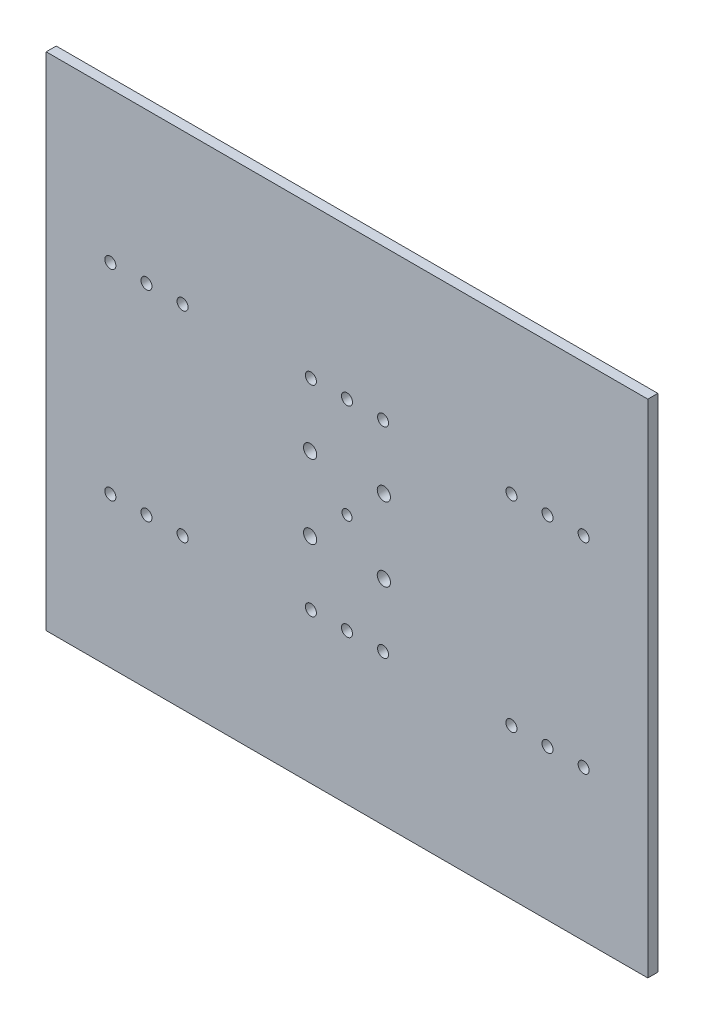
ISO-10303-21;
HEADER;
FILE_DESCRIPTION(('STEP AP214'),'2;1');
FILE_NAME('part.step','',(''),(''),'','','');
FILE_SCHEMA(('AUTOMOTIVE_DESIGN { 1 0 10303 214 1 1 1 1 }'));
ENDSEC;
DATA;
#1=APPLICATION_CONTEXT('core data for automotive mechanical design processes');
#2=APPLICATION_PROTOCOL_DEFINITION('international standard','automotive_design',2000,#1);
#3=PRODUCT_CONTEXT('',#1,'mechanical');
#4=PRODUCT('Part','Part','',(#3));
#5=PRODUCT_RELATED_PRODUCT_CATEGORY('part','',(#4));
#6=PRODUCT_DEFINITION_FORMATION('','',#4);
#7=PRODUCT_DEFINITION_CONTEXT('part definition',#1,'design');
#8=PRODUCT_DEFINITION('design','',#6,#7);
#9=PRODUCT_DEFINITION_SHAPE('','',#8);
#10=(LENGTH_UNIT() NAMED_UNIT(*) SI_UNIT(.MILLI.,.METRE.));
#11=(NAMED_UNIT(*) PLANE_ANGLE_UNIT() SI_UNIT($,.RADIAN.));
#12=(NAMED_UNIT(*) SI_UNIT($,.STERADIAN.) SOLID_ANGLE_UNIT());
#13=UNCERTAINTY_MEASURE_WITH_UNIT(LENGTH_MEASURE(1.E-05),#10,'distance_accuracy_value','');
#14=(GEOMETRIC_REPRESENTATION_CONTEXT(3) GLOBAL_UNCERTAINTY_ASSIGNED_CONTEXT((#13)) GLOBAL_UNIT_ASSIGNED_CONTEXT((#10,
#11,#12)) REPRESENTATION_CONTEXT('',''));
#15=CARTESIAN_POINT('',(0.,0.,0.));
#16=DIRECTION('',(0.,0.,1.));
#17=DIRECTION('',(1.,0.,0.));
#18=AXIS2_PLACEMENT_3D('',#15,#16,#17);
#19=CARTESIAN_POINT('',(0.,0.,5.));
#20=DIRECTION('',(0.,0.,1.));
#21=DIRECTION('',(1.,0.,0.));
#22=AXIS2_PLACEMENT_3D('',#19,#20,#21);
#23=PLANE('',#22);
#24=CARTESIAN_POINT('',(118.,-49.9999999999999,5.));
#25=DIRECTION('',(0.,0.,1.));
#26=DIRECTION('',(1.,0.,0.));
#27=AXIS2_PLACEMENT_3D('',#24,#25,#26);
#28=CIRCLE('',#27,2.75000000000001);
#29=CARTESIAN_POINT('',(120.75,-49.9999999999999,5.));
#30=VERTEX_POINT('',#29);
#31=EDGE_CURVE('E257',#30,#30,#28,.T.);
#32=ORIENTED_EDGE('',*,*,#31,.F.);
#33=EDGE_LOOP('',(#32));
#34=FACE_BOUND('',#33,.T.);
#35=CARTESIAN_POINT('',(-18.,-49.9999999999999,5.));
#36=DIRECTION('',(0.,0.,1.));
#37=DIRECTION('',(-1.,0.,0.));
#38=AXIS2_PLACEMENT_3D('',#35,#36,#37);
#39=CIRCLE('',#38,2.75);
#40=CARTESIAN_POINT('',(-20.75,-49.9999999999999,5.));
#41=VERTEX_POINT('',#40);
#42=EDGE_CURVE('E266',#41,#41,#39,.T.);
#43=ORIENTED_EDGE('',*,*,#42,.F.);
#44=EDGE_LOOP('',(#43));
#45=FACE_BOUND('',#44,.T.);
#46=CARTESIAN_POINT('',(-18.,50.,5.));
#47=DIRECTION('',(0.,0.,1.));
#48=DIRECTION('',(1.,0.,0.));
#49=AXIS2_PLACEMENT_3D('',#46,#47,#48);
#50=CIRCLE('',#49,2.75);
#51=CARTESIAN_POINT('',(-15.25,50.,5.));
#52=VERTEX_POINT('',#51);
#53=EDGE_CURVE('E241',#52,#52,#50,.T.);
#54=ORIENTED_EDGE('',*,*,#53,.F.);
#55=EDGE_LOOP('',(#54));
#56=FACE_BOUND('',#55,.T.);
#57=CARTESIAN_POINT('',(-118.,-49.9999999999999,5.));
#58=DIRECTION('',(0.,0.,1.));
#59=DIRECTION('',(-1.,0.,0.));
#60=AXIS2_PLACEMENT_3D('',#57,#58,#59);
#61=CIRCLE('',#60,2.75000000000001);
#62=CARTESIAN_POINT('',(-120.75,-49.9999999999999,5.));
#63=VERTEX_POINT('',#62);
#64=EDGE_CURVE('E250',#63,#63,#61,.T.);
#65=ORIENTED_EDGE('',*,*,#64,.F.);
#66=EDGE_LOOP('',(#65));
#67=FACE_BOUND('',#66,.T.);
#68=CARTESIAN_POINT('',(81.9999999999999,-49.9999999999999,5.));
#69=DIRECTION('',(0.,0.,1.));
#70=DIRECTION('',(-1.,0.,0.));
#71=AXIS2_PLACEMENT_3D('',#68,#69,#70);
#72=CIRCLE('',#71,2.74999999999998);
#73=CARTESIAN_POINT('',(79.2499999999999,-49.9999999999999,5.));
#74=VERTEX_POINT('',#73);
#75=EDGE_CURVE('E298',#74,#74,#72,.T.);
#76=ORIENTED_EDGE('',*,*,#75,.F.);
#77=EDGE_LOOP('',(#76));
#78=FACE_BOUND('',#77,.T.);
#79=CARTESIAN_POINT('',(17.9999999999999,-49.9999999999999,5.));
#80=DIRECTION('',(0.,0.,1.));
#81=DIRECTION('',(1.,0.,0.));
#82=AXIS2_PLACEMENT_3D('',#79,#80,#81);
#83=CIRCLE('',#82,2.75);
#84=CARTESIAN_POINT('',(20.7499999999999,-49.9999999999999,5.));
#85=VERTEX_POINT('',#84);
#86=EDGE_CURVE('E290',#85,#85,#83,.T.);
#87=ORIENTED_EDGE('',*,*,#86,.F.);
#88=EDGE_LOOP('',(#87));
#89=FACE_BOUND('',#88,.T.);
#90=CARTESIAN_POINT('',(17.9999999999999,50.,5.));
#91=DIRECTION('',(0.,0.,1.));
#92=DIRECTION('',(-1.,0.,0.));
#93=AXIS2_PLACEMENT_3D('',#90,#91,#92);
#94=CIRCLE('',#93,2.75);
#95=CARTESIAN_POINT('',(15.2499999999999,50.,5.));
#96=VERTEX_POINT('',#95);
#97=EDGE_CURVE('E282',#96,#96,#94,.T.);
#98=ORIENTED_EDGE('',*,*,#97,.F.);
#99=EDGE_LOOP('',(#98));
#100=FACE_BOUND('',#99,.T.);
#101=CARTESIAN_POINT('',(81.9999999999999,50.,5.));
#102=DIRECTION('',(0.,0.,1.));
#103=DIRECTION('',(1.,0.,0.));
#104=AXIS2_PLACEMENT_3D('',#101,#102,#103);
#105=CIRCLE('',#104,2.75000000000001);
#106=CARTESIAN_POINT('',(84.7499999999999,50.,5.));
#107=VERTEX_POINT('',#106);
#108=EDGE_CURVE('E273',#107,#107,#105,.T.);
#109=ORIENTED_EDGE('',*,*,#108,.F.);
#110=EDGE_LOOP('',(#109));
#111=FACE_BOUND('',#110,.T.);
#112=CARTESIAN_POINT('',(-82.,-49.9999999999999,5.));
#113=DIRECTION('',(0.,0.,1.));
#114=DIRECTION('',(1.,0.,0.));
#115=AXIS2_PLACEMENT_3D('',#112,#113,#114);
#116=CIRCLE('',#115,2.74999999999998);
#117=CARTESIAN_POINT('',(-79.25,-49.9999999999999,5.));
#118=VERTEX_POINT('',#117);
#119=EDGE_CURVE('E177',#118,#118,#116,.T.);
#120=ORIENTED_EDGE('',*,*,#119,.F.);
#121=EDGE_LOOP('',(#120));
#122=FACE_BOUND('',#121,.T.);
#123=CARTESIAN_POINT('',(-82.,50.,5.));
#124=DIRECTION('',(0.,0.,1.));
#125=DIRECTION('',(-1.,0.,0.));
#126=AXIS2_PLACEMENT_3D('',#123,#124,#125);
#127=CIRCLE('',#126,2.75000000000001);
#128=CARTESIAN_POINT('',(-84.75,50.,5.));
#129=VERTEX_POINT('',#128);
#130=EDGE_CURVE('E186',#129,#129,#127,.T.);
#131=ORIENTED_EDGE('',*,*,#130,.F.);
#132=EDGE_LOOP('',(#131));
#133=FACE_BOUND('',#132,.T.);
#134=CARTESIAN_POINT('',(-118.,50.,5.));
#135=DIRECTION('',(0.,0.,1.));
#136=DIRECTION('',(1.,0.,0.));
#137=AXIS2_PLACEMENT_3D('',#134,#135,#136);
#138=CIRCLE('',#137,2.75000000000001);
#139=CARTESIAN_POINT('',(-115.25,50.,5.));
#140=VERTEX_POINT('',#139);
#141=EDGE_CURVE('E194',#140,#140,#138,.T.);
#142=ORIENTED_EDGE('',*,*,#141,.F.);
#143=EDGE_LOOP('',(#142));
#144=FACE_BOUND('',#143,.T.);
#145=CARTESIAN_POINT('',(-100.,-50.,5.));
#146=DIRECTION('',(0.,0.,1.));
#147=DIRECTION('',(1.,0.,0.));
#148=AXIS2_PLACEMENT_3D('',#145,#146,#147);
#149=CIRCLE('',#148,2.75000000000001);
#150=CARTESIAN_POINT('',(-97.25,-50.,5.));
#151=VERTEX_POINT('',#150);
#152=EDGE_CURVE('E202',#151,#151,#149,.T.);
#153=ORIENTED_EDGE('',*,*,#152,.F.);
#154=EDGE_LOOP('',(#153));
#155=FACE_BOUND('',#154,.T.);
#156=CARTESIAN_POINT('',(0.,-50.,5.));
#157=DIRECTION('',(0.,0.,1.));
#158=DIRECTION('',(1.,0.,0.));
#159=AXIS2_PLACEMENT_3D('',#156,#157,#158);
#160=CIRCLE('',#159,2.75);
#161=CARTESIAN_POINT('',(2.75,-50.,5.));
#162=VERTEX_POINT('',#161);
#163=EDGE_CURVE('E210',#162,#162,#160,.T.);
#164=ORIENTED_EDGE('',*,*,#163,.F.);
#165=EDGE_LOOP('',(#164));
#166=FACE_BOUND('',#165,.T.);
#167=CARTESIAN_POINT('',(100.,-50.,5.));
#168=DIRECTION('',(0.,0.,1.));
#169=DIRECTION('',(1.,0.,0.));
#170=AXIS2_PLACEMENT_3D('',#167,#168,#169);
#171=CIRCLE('',#170,2.75000000000001);
#172=CARTESIAN_POINT('',(102.75,-50.,5.));
#173=VERTEX_POINT('',#172);
#174=EDGE_CURVE('E218',#173,#173,#171,.T.);
#175=ORIENTED_EDGE('',*,*,#174,.F.);
#176=EDGE_LOOP('',(#175));
#177=FACE_BOUND('',#176,.T.);
#178=CARTESIAN_POINT('',(100.,50.,5.));
#179=DIRECTION('',(0.,0.,1.));
#180=DIRECTION('',(1.,0.,0.));
#181=AXIS2_PLACEMENT_3D('',#178,#179,#180);
#182=CIRCLE('',#181,2.75000000000001);
#183=CARTESIAN_POINT('',(102.75,50.,5.));
#184=VERTEX_POINT('',#183);
#185=EDGE_CURVE('E226',#184,#184,#182,.T.);
#186=ORIENTED_EDGE('',*,*,#185,.F.);
#187=EDGE_LOOP('',(#186));
#188=FACE_BOUND('',#187,.T.);
#189=CARTESIAN_POINT('',(0.,50.,5.));
#190=DIRECTION('',(0.,0.,1.));
#191=DIRECTION('',(1.,0.,0.));
#192=AXIS2_PLACEMENT_3D('',#189,#190,#191);
#193=CIRCLE('',#192,2.75);
#194=CARTESIAN_POINT('',(2.75,50.,5.));
#195=VERTEX_POINT('',#194);
#196=EDGE_CURVE('E234',#195,#195,#193,.T.);
#197=ORIENTED_EDGE('',*,*,#196,.F.);
#198=EDGE_LOOP('',(#197));
#199=FACE_BOUND('',#198,.T.);
#200=CARTESIAN_POINT('',(118.,50.,5.));
#201=DIRECTION('',(0.,0.,1.));
#202=DIRECTION('',(-1.,0.,0.));
#203=AXIS2_PLACEMENT_3D('',#200,#201,#202);
#204=CIRCLE('',#203,2.75000000000001);
#205=CARTESIAN_POINT('',(115.25,50.,5.));
#206=VERTEX_POINT('',#205);
#207=EDGE_CURVE('E305',#206,#206,#204,.T.);
#208=ORIENTED_EDGE('',*,*,#207,.F.);
#209=EDGE_LOOP('',(#208));
#210=FACE_BOUND('',#209,.T.);
#211=CARTESIAN_POINT('',(-100.,50.,5.));
#212=DIRECTION('',(0.,0.,1.));
#213=DIRECTION('',(1.,0.,0.));
#214=AXIS2_PLACEMENT_3D('',#211,#212,#213);
#215=CIRCLE('',#214,2.75000000000001);
#216=CARTESIAN_POINT('',(-97.25,50.,5.));
#217=VERTEX_POINT('',#216);
#218=EDGE_CURVE('E169',#217,#217,#215,.T.);
#219=ORIENTED_EDGE('',*,*,#218,.F.);
#220=EDGE_LOOP('',(#219));
#221=FACE_BOUND('',#220,.T.);
#222=CARTESIAN_POINT('',(-18.3847763108501,-18.3847763108503,5.));
#223=DIRECTION('',(0.,0.,1.));
#224=DIRECTION('',(-1.,0.,0.));
#225=AXIS2_PLACEMENT_3D('',#222,#223,#224);
#226=CIRCLE('',#225,3.29999999999999);
#227=CARTESIAN_POINT('',(-21.6847763108501,-18.3847763108503,5.));
#228=VERTEX_POINT('',#227);
#229=EDGE_CURVE('E149',#228,#228,#226,.T.);
#230=ORIENTED_EDGE('',*,*,#229,.F.);
#231=EDGE_LOOP('',(#230));
#232=FACE_BOUND('',#231,.T.);
#233=CARTESIAN_POINT('',(18.38477631085,18.3847763108503,5.));
#234=DIRECTION('',(0.,0.,1.));
#235=DIRECTION('',(-1.,0.,0.));
#236=AXIS2_PLACEMENT_3D('',#233,#234,#235);
#237=CIRCLE('',#236,3.3);
#238=CARTESIAN_POINT('',(15.08477631085,18.3847763108503,5.));
#239=VERTEX_POINT('',#238);
#240=EDGE_CURVE('E133',#239,#239,#237,.T.);
#241=ORIENTED_EDGE('',*,*,#240,.F.);
#242=EDGE_LOOP('',(#241));
#243=FACE_BOUND('',#242,.T.);
#244=DIRECTION('',(0.,-1.,0.));
#245=VECTOR('',#244,1.);
#246=CARTESIAN_POINT('',(-150.,-125.,5.));
#247=LINE('',#246,#245);
#248=CARTESIAN_POINT('',(-150.,125.,5.));
#249=VERTEX_POINT('',#248);
#250=CARTESIAN_POINT('',(-150.,-125.,5.));
#251=VERTEX_POINT('',#250);
#252=EDGE_CURVE('E91',#249,#251,#247,.T.);
#253=ORIENTED_EDGE('',*,*,#252,.T.);
#254=DIRECTION('',(1.,0.,0.));
#255=VECTOR('',#254,1.);
#256=CARTESIAN_POINT('',(150.,-125.,5.));
#257=LINE('',#256,#255);
#258=CARTESIAN_POINT('',(150.,-125.,5.));
#259=VERTEX_POINT('',#258);
#260=EDGE_CURVE('E86',#251,#259,#257,.T.);
#261=ORIENTED_EDGE('',*,*,#260,.T.);
#262=DIRECTION('',(0.,1.,0.));
#263=VECTOR('',#262,1.);
#264=CARTESIAN_POINT('',(150.,-125.,5.));
#265=LINE('',#264,#263);
#266=CARTESIAN_POINT('',(150.,125.,5.));
#267=VERTEX_POINT('',#266);
#268=EDGE_CURVE('E89',#259,#267,#265,.T.);
#269=ORIENTED_EDGE('',*,*,#268,.T.);
#270=DIRECTION('',(-1.,0.,0.));
#271=VECTOR('',#270,1.);
#272=CARTESIAN_POINT('',(150.,125.,5.));
#273=LINE('',#272,#271);
#274=EDGE_CURVE('E56',#267,#249,#273,.T.);
#275=ORIENTED_EDGE('',*,*,#274,.T.);
#276=EDGE_LOOP('',(#253,#261,#269,#275));
#277=FACE_BOUND('',#276,.T.);
#278=CARTESIAN_POINT('',(-18.3847763108501,18.3847763108503,5.));
#279=DIRECTION('',(0.,0.,1.));
#280=DIRECTION('',(1.,0.,0.));
#281=AXIS2_PLACEMENT_3D('',#278,#279,#280);
#282=CIRCLE('',#281,3.3);
#283=CARTESIAN_POINT('',(-15.0847763108501,18.3847763108503,5.));
#284=VERTEX_POINT('',#283);
#285=EDGE_CURVE('E111',#284,#284,#282,.T.);
#286=ORIENTED_EDGE('',*,*,#285,.F.);
#287=EDGE_LOOP('',(#286));
#288=FACE_BOUND('',#287,.T.);
#289=CARTESIAN_POINT('',(18.38477631085,-18.3847763108503,5.));
#290=DIRECTION('',(0.,0.,1.));
#291=DIRECTION('',(1.,0.,0.));
#292=AXIS2_PLACEMENT_3D('',#289,#290,#291);
#293=CIRCLE('',#292,3.3);
#294=CARTESIAN_POINT('',(21.68477631085,-18.3847763108503,5.));
#295=VERTEX_POINT('',#294);
#296=EDGE_CURVE('E141',#295,#295,#293,.T.);
#297=ORIENTED_EDGE('',*,*,#296,.F.);
#298=EDGE_LOOP('',(#297));
#299=FACE_BOUND('',#298,.T.);
#300=CARTESIAN_POINT('',(0.,0.,5.));
#301=DIRECTION('',(0.,0.,1.));
#302=DIRECTION('',(1.,0.,0.));
#303=AXIS2_PLACEMENT_3D('',#300,#301,#302);
#304=CIRCLE('',#303,2.5);
#305=CARTESIAN_POINT('',(2.49999999999992,0.,5.));
#306=VERTEX_POINT('',#305);
#307=EDGE_CURVE('E157',#306,#306,#304,.T.);
#308=ORIENTED_EDGE('',*,*,#307,.F.);
#309=EDGE_LOOP('',(#308));
#310=FACE_BOUND('',#309,.T.);
#311=ADVANCED_FACE('F38',(#34,#45,#56,#67,#78,#89,#100,#111,#122,#133,#144,#155,#166,#177,#188,
#199,#210,#221,#232,#243,#277,#288,#299,#310),#23,.T.);
#312=CARTESIAN_POINT('',(0.,0.,0.));
#313=DIRECTION('',(0.,0.,1.));
#314=DIRECTION('',(1.,0.,0.));
#315=AXIS2_PLACEMENT_3D('',#312,#313,#314);
#316=PLANE('',#315);
#317=CARTESIAN_POINT('',(118.,-49.9999999999999,0.));
#318=DIRECTION('',(0.,0.,1.));
#319=DIRECTION('',(1.,0.,0.));
#320=AXIS2_PLACEMENT_3D('',#317,#318,#319);
#321=CIRCLE('',#320,2.75000000000001);
#322=CARTESIAN_POINT('',(120.75,-49.9999999999999,0.));
#323=VERTEX_POINT('',#322);
#324=EDGE_CURVE('E261',#323,#323,#321,.T.);
#325=ORIENTED_EDGE('',*,*,#324,.T.);
#326=EDGE_LOOP('',(#325));
#327=FACE_BOUND('',#326,.T.);
#328=CARTESIAN_POINT('',(-18.,-49.9999999999999,0.));
#329=DIRECTION('',(0.,0.,1.));
#330=DIRECTION('',(-1.,0.,0.));
#331=AXIS2_PLACEMENT_3D('',#328,#329,#330);
#332=CIRCLE('',#331,2.75);
#333=CARTESIAN_POINT('',(-20.75,-49.9999999999999,0.));
#334=VERTEX_POINT('',#333);
#335=EDGE_CURVE('E246',#334,#334,#332,.T.);
#336=ORIENTED_EDGE('',*,*,#335,.T.);
#337=EDGE_LOOP('',(#336));
#338=FACE_BOUND('',#337,.T.);
#339=CARTESIAN_POINT('',(-18.,50.,0.));
#340=DIRECTION('',(0.,0.,1.));
#341=DIRECTION('',(1.,0.,0.));
#342=AXIS2_PLACEMENT_3D('',#339,#340,#341);
#343=CIRCLE('',#342,2.75);
#344=CARTESIAN_POINT('',(-15.25,50.,0.));
#345=VERTEX_POINT('',#344);
#346=EDGE_CURVE('E245',#345,#345,#343,.T.);
#347=ORIENTED_EDGE('',*,*,#346,.T.);
#348=EDGE_LOOP('',(#347));
#349=FACE_BOUND('',#348,.T.);
#350=CARTESIAN_POINT('',(-118.,-49.9999999999999,0.));
#351=DIRECTION('',(0.,0.,1.));
#352=DIRECTION('',(-1.,0.,0.));
#353=AXIS2_PLACEMENT_3D('',#350,#351,#352);
#354=CIRCLE('',#353,2.75000000000001);
#355=CARTESIAN_POINT('',(-120.75,-49.9999999999999,0.));
#356=VERTEX_POINT('',#355);
#357=EDGE_CURVE('E182',#356,#356,#354,.T.);
#358=ORIENTED_EDGE('',*,*,#357,.T.);
#359=EDGE_LOOP('',(#358));
#360=FACE_BOUND('',#359,.T.);
#361=CARTESIAN_POINT('',(81.9999999999999,-49.9999999999999,0.));
#362=DIRECTION('',(0.,0.,1.));
#363=DIRECTION('',(-1.,0.,0.));
#364=AXIS2_PLACEMENT_3D('',#361,#362,#363);
#365=CIRCLE('',#364,2.74999999999998);
#366=CARTESIAN_POINT('',(79.2499999999999,-49.9999999999999,0.));
#367=VERTEX_POINT('',#366);
#368=EDGE_CURVE('E262',#367,#367,#365,.T.);
#369=ORIENTED_EDGE('',*,*,#368,.T.);
#370=EDGE_LOOP('',(#369));
#371=FACE_BOUND('',#370,.T.);
#372=CARTESIAN_POINT('',(17.9999999999999,-49.9999999999999,0.));
#373=DIRECTION('',(0.,0.,1.));
#374=DIRECTION('',(1.,0.,0.));
#375=AXIS2_PLACEMENT_3D('',#372,#373,#374);
#376=CIRCLE('',#375,2.75);
#377=CARTESIAN_POINT('',(20.7499999999999,-49.9999999999999,0.));
#378=VERTEX_POINT('',#377);
#379=EDGE_CURVE('E294',#378,#378,#376,.T.);
#380=ORIENTED_EDGE('',*,*,#379,.T.);
#381=EDGE_LOOP('',(#380));
#382=FACE_BOUND('',#381,.T.);
#383=CARTESIAN_POINT('',(17.9999999999999,50.,0.));
#384=DIRECTION('',(0.,0.,1.));
#385=DIRECTION('',(-1.,0.,0.));
#386=AXIS2_PLACEMENT_3D('',#383,#384,#385);
#387=CIRCLE('',#386,2.75);
#388=CARTESIAN_POINT('',(15.2499999999999,50.,0.));
#389=VERTEX_POINT('',#388);
#390=EDGE_CURVE('E286',#389,#389,#387,.T.);
#391=ORIENTED_EDGE('',*,*,#390,.T.);
#392=EDGE_LOOP('',(#391));
#393=FACE_BOUND('',#392,.T.);
#394=CARTESIAN_POINT('',(81.9999999999999,50.,0.));
#395=DIRECTION('',(0.,0.,1.));
#396=DIRECTION('',(1.,0.,0.));
#397=AXIS2_PLACEMENT_3D('',#394,#395,#396);
#398=CIRCLE('',#397,2.75000000000001);
#399=CARTESIAN_POINT('',(84.7499999999999,50.,0.));
#400=VERTEX_POINT('',#399);
#401=EDGE_CURVE('E277',#400,#400,#398,.T.);
#402=ORIENTED_EDGE('',*,*,#401,.T.);
#403=EDGE_LOOP('',(#402));
#404=FACE_BOUND('',#403,.T.);
#405=CARTESIAN_POINT('',(-82.,-49.9999999999999,0.));
#406=DIRECTION('',(0.,0.,1.));
#407=DIRECTION('',(1.,0.,0.));
#408=AXIS2_PLACEMENT_3D('',#405,#406,#407);
#409=CIRCLE('',#408,2.74999999999998);
#410=CARTESIAN_POINT('',(-79.25,-49.9999999999999,0.));
#411=VERTEX_POINT('',#410);
#412=EDGE_CURVE('E181',#411,#411,#409,.T.);
#413=ORIENTED_EDGE('',*,*,#412,.T.);
#414=EDGE_LOOP('',(#413));
#415=FACE_BOUND('',#414,.T.);
#416=CARTESIAN_POINT('',(-82.,50.,0.));
#417=DIRECTION('',(0.,0.,1.));
#418=DIRECTION('',(-1.,0.,0.));
#419=AXIS2_PLACEMENT_3D('',#416,#417,#418);
#420=CIRCLE('',#419,2.75000000000001);
#421=CARTESIAN_POINT('',(-84.75,50.,0.));
#422=VERTEX_POINT('',#421);
#423=EDGE_CURVE('E190',#422,#422,#420,.T.);
#424=ORIENTED_EDGE('',*,*,#423,.T.);
#425=EDGE_LOOP('',(#424));
#426=FACE_BOUND('',#425,.T.);
#427=CARTESIAN_POINT('',(-118.,50.,0.));
#428=DIRECTION('',(0.,0.,1.));
#429=DIRECTION('',(1.,0.,0.));
#430=AXIS2_PLACEMENT_3D('',#427,#428,#429);
#431=CIRCLE('',#430,2.75000000000001);
#432=CARTESIAN_POINT('',(-115.25,50.,0.));
#433=VERTEX_POINT('',#432);
#434=EDGE_CURVE('E198',#433,#433,#431,.T.);
#435=ORIENTED_EDGE('',*,*,#434,.T.);
#436=EDGE_LOOP('',(#435));
#437=FACE_BOUND('',#436,.T.);
#438=CARTESIAN_POINT('',(-100.,-50.,0.));
#439=DIRECTION('',(0.,0.,1.));
#440=DIRECTION('',(1.,0.,0.));
#441=AXIS2_PLACEMENT_3D('',#438,#439,#440);
#442=CIRCLE('',#441,2.75000000000001);
#443=CARTESIAN_POINT('',(-97.25,-50.,0.));
#444=VERTEX_POINT('',#443);
#445=EDGE_CURVE('E206',#444,#444,#442,.T.);
#446=ORIENTED_EDGE('',*,*,#445,.T.);
#447=EDGE_LOOP('',(#446));
#448=FACE_BOUND('',#447,.T.);
#449=CARTESIAN_POINT('',(0.,-50.,0.));
#450=DIRECTION('',(0.,0.,1.));
#451=DIRECTION('',(1.,0.,0.));
#452=AXIS2_PLACEMENT_3D('',#449,#450,#451);
#453=CIRCLE('',#452,2.75);
#454=CARTESIAN_POINT('',(2.75,-50.,0.));
#455=VERTEX_POINT('',#454);
#456=EDGE_CURVE('E214',#455,#455,#453,.T.);
#457=ORIENTED_EDGE('',*,*,#456,.T.);
#458=EDGE_LOOP('',(#457));
#459=FACE_BOUND('',#458,.T.);
#460=CARTESIAN_POINT('',(100.,-50.,0.));
#461=DIRECTION('',(0.,0.,1.));
#462=DIRECTION('',(1.,0.,0.));
#463=AXIS2_PLACEMENT_3D('',#460,#461,#462);
#464=CIRCLE('',#463,2.75000000000001);
#465=CARTESIAN_POINT('',(102.75,-50.,0.));
#466=VERTEX_POINT('',#465);
#467=EDGE_CURVE('E222',#466,#466,#464,.T.);
#468=ORIENTED_EDGE('',*,*,#467,.T.);
#469=EDGE_LOOP('',(#468));
#470=FACE_BOUND('',#469,.T.);
#471=CARTESIAN_POINT('',(100.,50.,0.));
#472=DIRECTION('',(0.,0.,1.));
#473=DIRECTION('',(1.,0.,0.));
#474=AXIS2_PLACEMENT_3D('',#471,#472,#473);
#475=CIRCLE('',#474,2.75000000000001);
#476=CARTESIAN_POINT('',(102.75,50.,0.));
#477=VERTEX_POINT('',#476);
#478=EDGE_CURVE('E230',#477,#477,#475,.T.);
#479=ORIENTED_EDGE('',*,*,#478,.T.);
#480=EDGE_LOOP('',(#479));
#481=FACE_BOUND('',#480,.T.);
#482=CARTESIAN_POINT('',(0.,50.,0.));
#483=DIRECTION('',(0.,0.,1.));
#484=DIRECTION('',(1.,0.,0.));
#485=AXIS2_PLACEMENT_3D('',#482,#483,#484);
#486=CIRCLE('',#485,2.75);
#487=CARTESIAN_POINT('',(2.75,50.,0.));
#488=VERTEX_POINT('',#487);
#489=EDGE_CURVE('E173',#488,#488,#486,.T.);
#490=ORIENTED_EDGE('',*,*,#489,.T.);
#491=EDGE_LOOP('',(#490));
#492=FACE_BOUND('',#491,.T.);
#493=CARTESIAN_POINT('',(118.,50.,0.));
#494=DIRECTION('',(0.,0.,1.));
#495=DIRECTION('',(-1.,0.,0.));
#496=AXIS2_PLACEMENT_3D('',#493,#494,#495);
#497=CIRCLE('',#496,2.75000000000001);
#498=CARTESIAN_POINT('',(115.25,50.,0.));
#499=VERTEX_POINT('',#498);
#500=EDGE_CURVE('E278',#499,#499,#497,.T.);
#501=ORIENTED_EDGE('',*,*,#500,.T.);
#502=EDGE_LOOP('',(#501));
#503=FACE_BOUND('',#502,.T.);
#504=CARTESIAN_POINT('',(-100.,50.,0.));
#505=DIRECTION('',(0.,0.,1.));
#506=DIRECTION('',(1.,0.,0.));
#507=AXIS2_PLACEMENT_3D('',#504,#505,#506);
#508=CIRCLE('',#507,2.75000000000001);
#509=CARTESIAN_POINT('',(-97.25,50.,0.));
#510=VERTEX_POINT('',#509);
#511=EDGE_CURVE('E165',#510,#510,#508,.T.);
#512=ORIENTED_EDGE('',*,*,#511,.T.);
#513=EDGE_LOOP('',(#512));
#514=FACE_BOUND('',#513,.T.);
#515=DIRECTION('',(0.,-1.,0.));
#516=VECTOR('',#515,1.);
#517=CARTESIAN_POINT('',(-150.,-125.,0.));
#518=LINE('',#517,#516);
#519=CARTESIAN_POINT('',(-150.,125.,0.));
#520=VERTEX_POINT('',#519);
#521=CARTESIAN_POINT('',(-150.,-125.,0.));
#522=VERTEX_POINT('',#521);
#523=EDGE_CURVE('E107',#520,#522,#518,.T.);
#524=ORIENTED_EDGE('',*,*,#523,.F.);
#525=DIRECTION('',(-1.,0.,0.));
#526=VECTOR('',#525,1.);
#527=CARTESIAN_POINT('',(150.,125.,0.));
#528=LINE('',#527,#526);
#529=CARTESIAN_POINT('',(150.,125.,0.));
#530=VERTEX_POINT('',#529);
#531=EDGE_CURVE('E79',#530,#520,#528,.T.);
#532=ORIENTED_EDGE('',*,*,#531,.F.);
#533=DIRECTION('',(0.,1.,0.));
#534=VECTOR('',#533,1.);
#535=CARTESIAN_POINT('',(150.,-125.,0.));
#536=LINE('',#535,#534);
#537=CARTESIAN_POINT('',(150.,-125.,0.));
#538=VERTEX_POINT('',#537);
#539=EDGE_CURVE('E73',#538,#530,#536,.T.);
#540=ORIENTED_EDGE('',*,*,#539,.F.);
#541=DIRECTION('',(1.,0.,0.));
#542=VECTOR('',#541,1.);
#543=CARTESIAN_POINT('',(150.,-125.,0.));
#544=LINE('',#543,#542);
#545=EDGE_CURVE('E96',#522,#538,#544,.T.);
#546=ORIENTED_EDGE('',*,*,#545,.F.);
#547=EDGE_LOOP('',(#524,#532,#540,#546));
#548=FACE_BOUND('',#547,.T.);
#549=CARTESIAN_POINT('',(-18.3847763108501,18.3847763108503,0.));
#550=DIRECTION('',(0.,0.,1.));
#551=DIRECTION('',(1.,0.,0.));
#552=AXIS2_PLACEMENT_3D('',#549,#550,#551);
#553=CIRCLE('',#552,3.3);
#554=CARTESIAN_POINT('',(-15.0847763108501,18.3847763108503,0.));
#555=VERTEX_POINT('',#554);
#556=EDGE_CURVE('E129',#555,#555,#553,.T.);
#557=ORIENTED_EDGE('',*,*,#556,.T.);
#558=EDGE_LOOP('',(#557));
#559=FACE_BOUND('',#558,.T.);
#560=CARTESIAN_POINT('',(18.38477631085,18.3847763108503,0.));
#561=DIRECTION('',(0.,0.,1.));
#562=DIRECTION('',(-1.,0.,0.));
#563=AXIS2_PLACEMENT_3D('',#560,#561,#562);
#564=CIRCLE('',#563,3.3);
#565=CARTESIAN_POINT('',(15.08477631085,18.3847763108503,0.));
#566=VERTEX_POINT('',#565);
#567=EDGE_CURVE('E137',#566,#566,#564,.T.);
#568=ORIENTED_EDGE('',*,*,#567,.T.);
#569=EDGE_LOOP('',(#568));
#570=FACE_BOUND('',#569,.T.);
#571=CARTESIAN_POINT('',(18.38477631085,-18.3847763108503,0.));
#572=DIRECTION('',(0.,0.,1.));
#573=DIRECTION('',(1.,0.,0.));
#574=AXIS2_PLACEMENT_3D('',#571,#572,#573);
#575=CIRCLE('',#574,3.3);
#576=CARTESIAN_POINT('',(21.68477631085,-18.3847763108503,0.));
#577=VERTEX_POINT('',#576);
#578=EDGE_CURVE('E145',#577,#577,#575,.T.);
#579=ORIENTED_EDGE('',*,*,#578,.T.);
#580=EDGE_LOOP('',(#579));
#581=FACE_BOUND('',#580,.T.);
#582=CARTESIAN_POINT('',(-18.3847763108501,-18.3847763108503,0.));
#583=DIRECTION('',(0.,0.,1.));
#584=DIRECTION('',(-1.,0.,0.));
#585=AXIS2_PLACEMENT_3D('',#582,#583,#584);
#586=CIRCLE('',#585,3.29999999999999);
#587=CARTESIAN_POINT('',(-21.6847763108501,-18.3847763108503,0.));
#588=VERTEX_POINT('',#587);
#589=EDGE_CURVE('E153',#588,#588,#586,.T.);
#590=ORIENTED_EDGE('',*,*,#589,.T.);
#591=EDGE_LOOP('',(#590));
#592=FACE_BOUND('',#591,.T.);
#593=CARTESIAN_POINT('',(0.,0.,0.));
#594=DIRECTION('',(0.,0.,1.));
#595=DIRECTION('',(1.,0.,0.));
#596=AXIS2_PLACEMENT_3D('',#593,#594,#595);
#597=CIRCLE('',#596,2.5);
#598=CARTESIAN_POINT('',(2.49999999999992,0.,0.));
#599=VERTEX_POINT('',#598);
#600=EDGE_CURVE('E161',#599,#599,#597,.T.);
#601=ORIENTED_EDGE('',*,*,#600,.T.);
#602=EDGE_LOOP('',(#601));
#603=FACE_BOUND('',#602,.T.);
#604=ADVANCED_FACE('F124',(#327,#338,#349,#360,#371,#382,#393,#404,#415,#426,#437,#448,#459,
#470,#481,#492,#503,#514,#548,#559,#570,#581,#592,#603),#316,.F.);
#605=CARTESIAN_POINT('',(-150.,-125.,5.));
#606=DIRECTION('',(1.,0.,0.));
#607=DIRECTION('',(0.,0.,-1.));
#608=AXIS2_PLACEMENT_3D('',#605,#606,#607);
#609=PLANE('',#608);
#610=ORIENTED_EDGE('',*,*,#523,.T.);
#611=DIRECTION('',(0.,0.,-1.));
#612=VECTOR('',#611,1.);
#613=CARTESIAN_POINT('',(-150.,-125.,5.));
#614=LINE('',#613,#612);
#615=EDGE_CURVE('E11',#251,#522,#614,.T.);
#616=ORIENTED_EDGE('',*,*,#615,.F.);
#617=ORIENTED_EDGE('',*,*,#252,.F.);
#618=DIRECTION('',(0.,0.,-1.));
#619=VECTOR('',#618,1.);
#620=CARTESIAN_POINT('',(-150.,125.,5.));
#621=LINE('',#620,#619);
#622=EDGE_CURVE('E103',#249,#520,#621,.T.);
#623=ORIENTED_EDGE('',*,*,#622,.T.);
#624=EDGE_LOOP('',(#610,#616,#617,#623));
#625=FACE_BOUND('',#624,.T.);
#626=ADVANCED_FACE('F40',(#625),#609,.F.);
#627=CARTESIAN_POINT('',(150.,-125.,5.));
#628=DIRECTION('',(0.,1.,0.));
#629=DIRECTION('',(-1.,0.,0.));
#630=AXIS2_PLACEMENT_3D('',#627,#628,#629);
#631=PLANE('',#630);
#632=ORIENTED_EDGE('',*,*,#545,.T.);
#633=DIRECTION('',(0.,0.,-1.));
#634=VECTOR('',#633,1.);
#635=CARTESIAN_POINT('',(150.,-125.,5.));
#636=LINE('',#635,#634);
#637=EDGE_CURVE('E48',#259,#538,#636,.T.);
#638=ORIENTED_EDGE('',*,*,#637,.F.);
#639=ORIENTED_EDGE('',*,*,#260,.F.);
#640=ORIENTED_EDGE('',*,*,#615,.T.);
#641=EDGE_LOOP('',(#632,#638,#639,#640));
#642=FACE_BOUND('',#641,.T.);
#643=ADVANCED_FACE('F95',(#642),#631,.F.);
#644=CARTESIAN_POINT('',(150.,-125.,5.));
#645=DIRECTION('',(-1.,0.,0.));
#646=DIRECTION('',(0.,-1.,0.));
#647=AXIS2_PLACEMENT_3D('',#644,#645,#646);
#648=PLANE('',#647);
#649=ORIENTED_EDGE('',*,*,#539,.T.);
#650=DIRECTION('',(0.,0.,-1.));
#651=VECTOR('',#650,1.);
#652=CARTESIAN_POINT('',(150.,125.,5.));
#653=LINE('',#652,#651);
#654=EDGE_CURVE('E98',#267,#530,#653,.T.);
#655=ORIENTED_EDGE('',*,*,#654,.F.);
#656=ORIENTED_EDGE('',*,*,#268,.F.);
#657=ORIENTED_EDGE('',*,*,#637,.T.);
#658=EDGE_LOOP('',(#649,#655,#656,#657));
#659=FACE_BOUND('',#658,.T.);
#660=ADVANCED_FACE('F99',(#659),#648,.F.);
#661=CARTESIAN_POINT('',(150.,125.,5.));
#662=DIRECTION('',(0.,-1.,0.));
#663=DIRECTION('',(1.,0.,0.));
#664=AXIS2_PLACEMENT_3D('',#661,#662,#663);
#665=PLANE('',#664);
#666=ORIENTED_EDGE('',*,*,#531,.T.);
#667=ORIENTED_EDGE('',*,*,#622,.F.);
#668=ORIENTED_EDGE('',*,*,#274,.F.);
#669=ORIENTED_EDGE('',*,*,#654,.T.);
#670=EDGE_LOOP('',(#666,#667,#668,#669));
#671=FACE_BOUND('',#670,.T.);
#672=ADVANCED_FACE('F121',(#671),#665,.F.);
#673=CARTESIAN_POINT('',(-18.3847763108501,18.3847763108503,5.));
#674=DIRECTION('',(0.,0.,-1.));
#675=DIRECTION('',(-1.,0.,0.));
#676=AXIS2_PLACEMENT_3D('',#673,#674,#675);
#677=CYLINDRICAL_SURFACE('',#676,3.3);
#678=ORIENTED_EDGE('',*,*,#285,.T.);
#679=EDGE_LOOP('',(#678));
#680=FACE_BOUND('',#679,.T.);
#681=ORIENTED_EDGE('',*,*,#556,.F.);
#682=EDGE_LOOP('',(#681));
#683=FACE_BOUND('',#682,.T.);
#684=ADVANCED_FACE('F337',(#680,#683),#677,.F.);
#685=CARTESIAN_POINT('',(18.38477631085,18.3847763108503,5.));
#686=DIRECTION('',(0.,0.,-1.));
#687=DIRECTION('',(-1.,0.,0.));
#688=AXIS2_PLACEMENT_3D('',#685,#686,#687);
#689=CYLINDRICAL_SURFACE('',#688,3.3);
#690=ORIENTED_EDGE('',*,*,#240,.T.);
#691=EDGE_LOOP('',(#690));
#692=FACE_BOUND('',#691,.T.);
#693=ORIENTED_EDGE('',*,*,#567,.F.);
#694=EDGE_LOOP('',(#693));
#695=FACE_BOUND('',#694,.T.);
#696=ADVANCED_FACE('F333',(#692,#695),#689,.F.);
#697=CARTESIAN_POINT('',(18.38477631085,-18.3847763108503,5.));
#698=DIRECTION('',(0.,0.,-1.));
#699=DIRECTION('',(-1.,0.,0.));
#700=AXIS2_PLACEMENT_3D('',#697,#698,#699);
#701=CYLINDRICAL_SURFACE('',#700,3.3);
#702=ORIENTED_EDGE('',*,*,#296,.T.);
#703=EDGE_LOOP('',(#702));
#704=FACE_BOUND('',#703,.T.);
#705=ORIENTED_EDGE('',*,*,#578,.F.);
#706=EDGE_LOOP('',(#705));
#707=FACE_BOUND('',#706,.T.);
#708=ADVANCED_FACE('F336',(#704,#707),#701,.F.);
#709=CARTESIAN_POINT('',(-18.3847763108501,-18.3847763108503,5.));
#710=DIRECTION('',(0.,0.,-1.));
#711=DIRECTION('',(-1.,0.,0.));
#712=AXIS2_PLACEMENT_3D('',#709,#710,#711);
#713=CYLINDRICAL_SURFACE('',#712,3.29999999999999);
#714=ORIENTED_EDGE('',*,*,#229,.T.);
#715=EDGE_LOOP('',(#714));
#716=FACE_BOUND('',#715,.T.);
#717=ORIENTED_EDGE('',*,*,#589,.F.);
#718=EDGE_LOOP('',(#717));
#719=FACE_BOUND('',#718,.T.);
#720=ADVANCED_FACE('F353',(#716,#719),#713,.F.);
#721=CARTESIAN_POINT('',(0.,0.,5.));
#722=DIRECTION('',(0.,0.,-1.));
#723=DIRECTION('',(-1.,0.,0.));
#724=AXIS2_PLACEMENT_3D('',#721,#722,#723);
#725=CYLINDRICAL_SURFACE('',#724,2.5);
#726=ORIENTED_EDGE('',*,*,#307,.T.);
#727=EDGE_LOOP('',(#726));
#728=FACE_BOUND('',#727,.T.);
#729=ORIENTED_EDGE('',*,*,#600,.F.);
#730=EDGE_LOOP('',(#729));
#731=FACE_BOUND('',#730,.T.);
#732=ADVANCED_FACE('F351',(#728,#731),#725,.F.);
#733=CARTESIAN_POINT('',(-100.,50.,0.));
#734=DIRECTION('',(0.,0.,1.));
#735=DIRECTION('',(1.,0.,0.));
#736=AXIS2_PLACEMENT_3D('',#733,#734,#735);
#737=CYLINDRICAL_SURFACE('',#736,2.75000000000001);
#738=ORIENTED_EDGE('',*,*,#511,.F.);
#739=EDGE_LOOP('',(#738));
#740=FACE_BOUND('',#739,.T.);
#741=ORIENTED_EDGE('',*,*,#218,.T.);
#742=EDGE_LOOP('',(#741));
#743=FACE_BOUND('',#742,.T.);
#744=ADVANCED_FACE('F319',(#740,#743),#737,.F.);
#745=CARTESIAN_POINT('',(118.,50.,0.));
#746=DIRECTION('',(0.,0.,1.));
#747=DIRECTION('',(1.,0.,0.));
#748=AXIS2_PLACEMENT_3D('',#745,#746,#747);
#749=CYLINDRICAL_SURFACE('',#748,2.75000000000001);
#750=ORIENTED_EDGE('',*,*,#500,.F.);
#751=EDGE_LOOP('',(#750));
#752=FACE_BOUND('',#751,.T.);
#753=ORIENTED_EDGE('',*,*,#207,.T.);
#754=EDGE_LOOP('',(#753));
#755=FACE_BOUND('',#754,.T.);
#756=ADVANCED_FACE('F315',(#752,#755),#749,.F.);
#757=CARTESIAN_POINT('',(0.,50.,0.));
#758=DIRECTION('',(0.,0.,1.));
#759=DIRECTION('',(1.,0.,0.));
#760=AXIS2_PLACEMENT_3D('',#757,#758,#759);
#761=CYLINDRICAL_SURFACE('',#760,2.75);
#762=ORIENTED_EDGE('',*,*,#489,.F.);
#763=EDGE_LOOP('',(#762));
#764=FACE_BOUND('',#763,.T.);
#765=ORIENTED_EDGE('',*,*,#196,.T.);
#766=EDGE_LOOP('',(#765));
#767=FACE_BOUND('',#766,.T.);
#768=ADVANCED_FACE('F318',(#764,#767),#761,.F.);
#769=CARTESIAN_POINT('',(100.,50.,0.));
#770=DIRECTION('',(0.,0.,1.));
#771=DIRECTION('',(1.,0.,0.));
#772=AXIS2_PLACEMENT_3D('',#769,#770,#771);
#773=CYLINDRICAL_SURFACE('',#772,2.75000000000001);
#774=ORIENTED_EDGE('',*,*,#478,.F.);
#775=EDGE_LOOP('',(#774));
#776=FACE_BOUND('',#775,.T.);
#777=ORIENTED_EDGE('',*,*,#185,.T.);
#778=EDGE_LOOP('',(#777));
#779=FACE_BOUND('',#778,.T.);
#780=ADVANCED_FACE('F457',(#776,#779),#773,.F.);
#781=CARTESIAN_POINT('',(100.,-50.,0.));
#782=DIRECTION('',(0.,0.,1.));
#783=DIRECTION('',(1.,0.,0.));
#784=AXIS2_PLACEMENT_3D('',#781,#782,#783);
#785=CYLINDRICAL_SURFACE('',#784,2.75000000000001);
#786=ORIENTED_EDGE('',*,*,#467,.F.);
#787=EDGE_LOOP('',(#786));
#788=FACE_BOUND('',#787,.T.);
#789=ORIENTED_EDGE('',*,*,#174,.T.);
#790=EDGE_LOOP('',(#789));
#791=FACE_BOUND('',#790,.T.);
#792=ADVANCED_FACE('F466',(#788,#791),#785,.F.);
#793=CARTESIAN_POINT('',(0.,-50.,0.));
#794=DIRECTION('',(0.,0.,1.));
#795=DIRECTION('',(1.,0.,0.));
#796=AXIS2_PLACEMENT_3D('',#793,#794,#795);
#797=CYLINDRICAL_SURFACE('',#796,2.75);
#798=ORIENTED_EDGE('',*,*,#456,.F.);
#799=EDGE_LOOP('',(#798));
#800=FACE_BOUND('',#799,.T.);
#801=ORIENTED_EDGE('',*,*,#163,.T.);
#802=EDGE_LOOP('',(#801));
#803=FACE_BOUND('',#802,.T.);
#804=ADVANCED_FACE('F475',(#800,#803),#797,.F.);
#805=CARTESIAN_POINT('',(-100.,-50.,0.));
#806=DIRECTION('',(0.,0.,1.));
#807=DIRECTION('',(1.,0.,0.));
#808=AXIS2_PLACEMENT_3D('',#805,#806,#807);
#809=CYLINDRICAL_SURFACE('',#808,2.75000000000001);
#810=ORIENTED_EDGE('',*,*,#445,.F.);
#811=EDGE_LOOP('',(#810));
#812=FACE_BOUND('',#811,.T.);
#813=ORIENTED_EDGE('',*,*,#152,.T.);
#814=EDGE_LOOP('',(#813));
#815=FACE_BOUND('',#814,.T.);
#816=ADVANCED_FACE('F484',(#812,#815),#809,.F.);
#817=CARTESIAN_POINT('',(-118.,50.,0.));
#818=DIRECTION('',(0.,0.,1.));
#819=DIRECTION('',(1.,0.,0.));
#820=AXIS2_PLACEMENT_3D('',#817,#818,#819);
#821=CYLINDRICAL_SURFACE('',#820,2.75000000000001);
#822=ORIENTED_EDGE('',*,*,#434,.F.);
#823=EDGE_LOOP('',(#822));
#824=FACE_BOUND('',#823,.T.);
#825=ORIENTED_EDGE('',*,*,#141,.T.);
#826=EDGE_LOOP('',(#825));
#827=FACE_BOUND('',#826,.T.);
#828=ADVANCED_FACE('F493',(#824,#827),#821,.F.);
#829=CARTESIAN_POINT('',(-82.,50.,0.));
#830=DIRECTION('',(0.,0.,1.));
#831=DIRECTION('',(1.,0.,0.));
#832=AXIS2_PLACEMENT_3D('',#829,#830,#831);
#833=CYLINDRICAL_SURFACE('',#832,2.75000000000001);
#834=ORIENTED_EDGE('',*,*,#423,.F.);
#835=EDGE_LOOP('',(#834));
#836=FACE_BOUND('',#835,.T.);
#837=ORIENTED_EDGE('',*,*,#130,.T.);
#838=EDGE_LOOP('',(#837));
#839=FACE_BOUND('',#838,.T.);
#840=ADVANCED_FACE('F502',(#836,#839),#833,.F.);
#841=CARTESIAN_POINT('',(-82.,-49.9999999999999,0.));
#842=DIRECTION('',(0.,0.,1.));
#843=DIRECTION('',(1.,0.,0.));
#844=AXIS2_PLACEMENT_3D('',#841,#842,#843);
#845=CYLINDRICAL_SURFACE('',#844,2.74999999999998);
#846=ORIENTED_EDGE('',*,*,#412,.F.);
#847=EDGE_LOOP('',(#846));
#848=FACE_BOUND('',#847,.T.);
#849=ORIENTED_EDGE('',*,*,#119,.T.);
#850=EDGE_LOOP('',(#849));
#851=FACE_BOUND('',#850,.T.);
#852=ADVANCED_FACE('F511',(#848,#851),#845,.F.);
#853=CARTESIAN_POINT('',(81.9999999999999,50.,0.));
#854=DIRECTION('',(0.,0.,1.));
#855=DIRECTION('',(1.,0.,0.));
#856=AXIS2_PLACEMENT_3D('',#853,#854,#855);
#857=CYLINDRICAL_SURFACE('',#856,2.75000000000001);
#858=ORIENTED_EDGE('',*,*,#401,.F.);
#859=EDGE_LOOP('',(#858));
#860=FACE_BOUND('',#859,.T.);
#861=ORIENTED_EDGE('',*,*,#108,.T.);
#862=EDGE_LOOP('',(#861));
#863=FACE_BOUND('',#862,.T.);
#864=ADVANCED_FACE('F520',(#860,#863),#857,.F.);
#865=CARTESIAN_POINT('',(17.9999999999999,50.,0.));
#866=DIRECTION('',(0.,0.,1.));
#867=DIRECTION('',(1.,0.,0.));
#868=AXIS2_PLACEMENT_3D('',#865,#866,#867);
#869=CYLINDRICAL_SURFACE('',#868,2.75);
#870=ORIENTED_EDGE('',*,*,#390,.F.);
#871=EDGE_LOOP('',(#870));
#872=FACE_BOUND('',#871,.T.);
#873=ORIENTED_EDGE('',*,*,#97,.T.);
#874=EDGE_LOOP('',(#873));
#875=FACE_BOUND('',#874,.T.);
#876=ADVANCED_FACE('F528',(#872,#875),#869,.F.);
#877=CARTESIAN_POINT('',(17.9999999999999,-49.9999999999999,0.));
#878=DIRECTION('',(0.,0.,1.));
#879=DIRECTION('',(1.,0.,0.));
#880=AXIS2_PLACEMENT_3D('',#877,#878,#879);
#881=CYLINDRICAL_SURFACE('',#880,2.75);
#882=ORIENTED_EDGE('',*,*,#379,.F.);
#883=EDGE_LOOP('',(#882));
#884=FACE_BOUND('',#883,.T.);
#885=ORIENTED_EDGE('',*,*,#86,.T.);
#886=EDGE_LOOP('',(#885));
#887=FACE_BOUND('',#886,.T.);
#888=ADVANCED_FACE('F537',(#884,#887),#881,.F.);
#889=CARTESIAN_POINT('',(81.9999999999999,-49.9999999999999,0.));
#890=DIRECTION('',(0.,0.,1.));
#891=DIRECTION('',(1.,0.,0.));
#892=AXIS2_PLACEMENT_3D('',#889,#890,#891);
#893=CYLINDRICAL_SURFACE('',#892,2.74999999999998);
#894=ORIENTED_EDGE('',*,*,#368,.F.);
#895=EDGE_LOOP('',(#894));
#896=FACE_BOUND('',#895,.T.);
#897=ORIENTED_EDGE('',*,*,#75,.T.);
#898=EDGE_LOOP('',(#897));
#899=FACE_BOUND('',#898,.T.);
#900=ADVANCED_FACE('F546',(#896,#899),#893,.F.);
#901=CARTESIAN_POINT('',(-118.,-49.9999999999999,0.));
#902=DIRECTION('',(0.,0.,1.));
#903=DIRECTION('',(1.,0.,0.));
#904=AXIS2_PLACEMENT_3D('',#901,#902,#903);
#905=CYLINDRICAL_SURFACE('',#904,2.75000000000001);
#906=ORIENTED_EDGE('',*,*,#357,.F.);
#907=EDGE_LOOP('',(#906));
#908=FACE_BOUND('',#907,.T.);
#909=ORIENTED_EDGE('',*,*,#64,.T.);
#910=EDGE_LOOP('',(#909));
#911=FACE_BOUND('',#910,.T.);
#912=ADVANCED_FACE('F555',(#908,#911),#905,.F.);
#913=CARTESIAN_POINT('',(-18.,50.,0.));
#914=DIRECTION('',(0.,0.,1.));
#915=DIRECTION('',(1.,0.,0.));
#916=AXIS2_PLACEMENT_3D('',#913,#914,#915);
#917=CYLINDRICAL_SURFACE('',#916,2.75);
#918=ORIENTED_EDGE('',*,*,#346,.F.);
#919=EDGE_LOOP('',(#918));
#920=FACE_BOUND('',#919,.T.);
#921=ORIENTED_EDGE('',*,*,#53,.T.);
#922=EDGE_LOOP('',(#921));
#923=FACE_BOUND('',#922,.T.);
#924=ADVANCED_FACE('F564',(#920,#923),#917,.F.);
#925=CARTESIAN_POINT('',(-18.,-49.9999999999999,0.));
#926=DIRECTION('',(0.,0.,1.));
#927=DIRECTION('',(1.,0.,0.));
#928=AXIS2_PLACEMENT_3D('',#925,#926,#927);
#929=CYLINDRICAL_SURFACE('',#928,2.75);
#930=ORIENTED_EDGE('',*,*,#335,.F.);
#931=EDGE_LOOP('',(#930));
#932=FACE_BOUND('',#931,.T.);
#933=ORIENTED_EDGE('',*,*,#42,.T.);
#934=EDGE_LOOP('',(#933));
#935=FACE_BOUND('',#934,.T.);
#936=ADVANCED_FACE('F573',(#932,#935),#929,.F.);
#937=CARTESIAN_POINT('',(118.,-49.9999999999999,0.));
#938=DIRECTION('',(0.,0.,1.));
#939=DIRECTION('',(1.,0.,0.));
#940=AXIS2_PLACEMENT_3D('',#937,#938,#939);
#941=CYLINDRICAL_SURFACE('',#940,2.75000000000001);
#942=ORIENTED_EDGE('',*,*,#324,.F.);
#943=EDGE_LOOP('',(#942));
#944=FACE_BOUND('',#943,.T.);
#945=ORIENTED_EDGE('',*,*,#31,.T.);
#946=EDGE_LOOP('',(#945));
#947=FACE_BOUND('',#946,.T.);
#948=ADVANCED_FACE('F582',(#944,#947),#941,.F.);
#949=CLOSED_SHELL('',(#311,#604,#626,#643,#660,#672,#684,#696,#708,#720,#732,#744,#756,#768,
#780,#792,#804,#816,#828,#840,#852,#864,#876,#888,#900,#912,#924,#936,#948));
#950=MANIFOLD_SOLID_BREP('B2',#949);
#951=ADVANCED_BREP_SHAPE_REPRESENTATION('',(#18,#950),#14);
#952=SHAPE_DEFINITION_REPRESENTATION(#9,#951);
ENDSEC;
END-ISO-10303-21;
